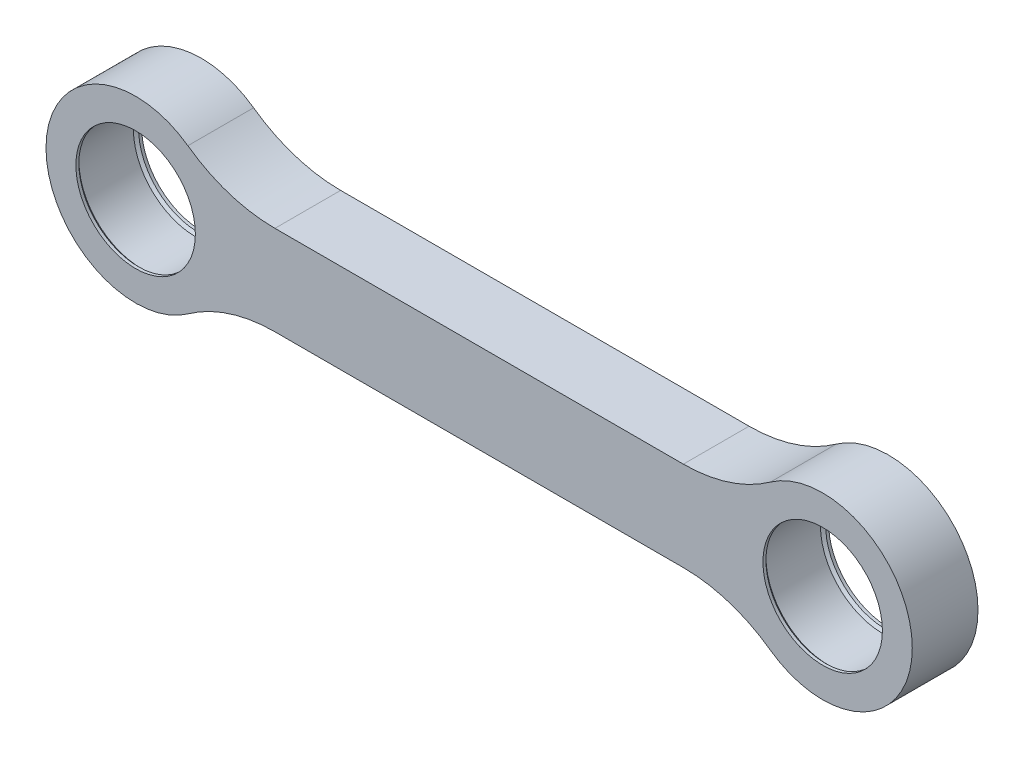
ISO-10303-21;
HEADER;
FILE_DESCRIPTION(('STEP AP214'),'2;1');
FILE_NAME('part.step','',(''),(''),'','','');
FILE_SCHEMA(('AUTOMOTIVE_DESIGN { 1 0 10303 214 1 1 1 1 }'));
ENDSEC;
DATA;
#1=APPLICATION_CONTEXT('core data for automotive mechanical design processes');
#2=APPLICATION_PROTOCOL_DEFINITION('international standard','automotive_design',2000,#1);
#3=PRODUCT_CONTEXT('',#1,'mechanical');
#4=PRODUCT('Part','Part','',(#3));
#5=PRODUCT_RELATED_PRODUCT_CATEGORY('part','',(#4));
#6=PRODUCT_DEFINITION_FORMATION('','',#4);
#7=PRODUCT_DEFINITION_CONTEXT('part definition',#1,'design');
#8=PRODUCT_DEFINITION('design','',#6,#7);
#9=PRODUCT_DEFINITION_SHAPE('','',#8);
#10=(LENGTH_UNIT() NAMED_UNIT(*) SI_UNIT(.MILLI.,.METRE.));
#11=(NAMED_UNIT(*) PLANE_ANGLE_UNIT() SI_UNIT($,.RADIAN.));
#12=(NAMED_UNIT(*) SI_UNIT($,.STERADIAN.) SOLID_ANGLE_UNIT());
#13=UNCERTAINTY_MEASURE_WITH_UNIT(LENGTH_MEASURE(1.E-05),#10,'distance_accuracy_value','');
#14=(GEOMETRIC_REPRESENTATION_CONTEXT(3) GLOBAL_UNCERTAINTY_ASSIGNED_CONTEXT((#13)) GLOBAL_UNIT_ASSIGNED_CONTEXT((#10,
#11,#12)) REPRESENTATION_CONTEXT('',''));
#15=CARTESIAN_POINT('',(0.,0.,0.));
#16=DIRECTION('',(0.,0.,1.));
#17=DIRECTION('',(1.,0.,0.));
#18=AXIS2_PLACEMENT_3D('',#15,#16,#17);
#19=CARTESIAN_POINT('',(46.,0.,4.));
#20=DIRECTION('',(0.,0.,-1.));
#21=DIRECTION('',(-1.,0.,0.));
#22=AXIS2_PLACEMENT_3D('',#19,#20,#21);
#23=CYLINDRICAL_SURFACE('',#22,4.00000000000001);
#24=CARTESIAN_POINT('',(46.,0.,-0.200000000000003));
#25=DIRECTION('',(0.,0.,1.));
#26=DIRECTION('',(1.,0.,0.));
#27=AXIS2_PLACEMENT_3D('',#24,#25,#26);
#28=CIRCLE('',#27,4.00000000000001);
#29=CARTESIAN_POINT('',(50.,0.,-0.200000000000003));
#30=VERTEX_POINT('',#29);
#31=EDGE_CURVE('E259',#30,#30,#28,.T.);
#32=ORIENTED_EDGE('',*,*,#31,.T.);
#33=EDGE_LOOP('',(#32));
#34=FACE_BOUND('',#33,.T.);
#35=CARTESIAN_POINT('',(46.,0.,-0.4));
#36=DIRECTION('',(0.,0.,1.));
#37=DIRECTION('',(1.,0.,0.));
#38=AXIS2_PLACEMENT_3D('',#35,#36,#37);
#39=CIRCLE('',#38,4.00000000000001);
#40=CARTESIAN_POINT('',(50.,0.,-0.4));
#41=VERTEX_POINT('',#40);
#42=EDGE_CURVE('E226',#41,#41,#39,.T.);
#43=ORIENTED_EDGE('',*,*,#42,.F.);
#44=EDGE_LOOP('',(#43));
#45=FACE_BOUND('',#44,.T.);
#46=ADVANCED_FACE('F135',(#34,#45),#23,.F.);
#47=CARTESIAN_POINT('',(0.,0.,-0.4));
#48=DIRECTION('',(0.,0.,1.));
#49=DIRECTION('',(1.,0.,0.));
#50=AXIS2_PLACEMENT_3D('',#47,#48,#49);
#51=CYLINDRICAL_SURFACE('',#50,4.);
#52=CARTESIAN_POINT('',(0.,0.,-0.200000000000004));
#53=DIRECTION('',(0.,0.,1.));
#54=DIRECTION('',(1.,0.,0.));
#55=AXIS2_PLACEMENT_3D('',#52,#53,#54);
#56=CIRCLE('',#55,4.);
#57=CARTESIAN_POINT('',(4.,0.,-0.200000000000004));
#58=VERTEX_POINT('',#57);
#59=EDGE_CURVE('E262',#58,#58,#56,.T.);
#60=ORIENTED_EDGE('',*,*,#59,.T.);
#61=EDGE_LOOP('',(#60));
#62=FACE_BOUND('',#61,.T.);
#63=CARTESIAN_POINT('',(0.,0.,-0.4));
#64=DIRECTION('',(0.,0.,1.));
#65=DIRECTION('',(1.,0.,0.));
#66=AXIS2_PLACEMENT_3D('',#63,#64,#65);
#67=CIRCLE('',#66,4.);
#68=CARTESIAN_POINT('',(4.,0.,-0.4));
#69=VERTEX_POINT('',#68);
#70=EDGE_CURVE('E248',#69,#69,#67,.T.);
#71=ORIENTED_EDGE('',*,*,#70,.F.);
#72=EDGE_LOOP('',(#71));
#73=FACE_BOUND('',#72,.T.);
#74=ADVANCED_FACE('F330',(#62,#73),#51,.F.);
#75=CARTESIAN_POINT('',(0.,0.,4.));
#76=DIRECTION('',(0.,0.,1.));
#77=DIRECTION('',(1.,0.,0.));
#78=AXIS2_PLACEMENT_3D('',#75,#76,#77);
#79=PLANE('',#78);
#80=DIRECTION('',(1.,0.,0.));
#81=VECTOR('',#80,1.);
#82=CARTESIAN_POINT('',(5.,3.,4.));
#83=LINE('',#82,#81);
#84=CARTESIAN_POINT('',(9.32737905308881,3.,4.));
#85=VERTEX_POINT('',#84);
#86=CARTESIAN_POINT('',(36.6726209469112,3.,4.));
#87=VERTEX_POINT('',#86);
#88=EDGE_CURVE('E229',#85,#87,#83,.T.);
#89=ORIENTED_EDGE('',*,*,#88,.F.);
#90=CARTESIAN_POINT('',(9.32737905308881,13.,4.));
#91=DIRECTION('',(0.,0.,1.));
#92=DIRECTION('',(1.,0.,0.));
#93=AXIS2_PLACEMENT_3D('',#90,#91,#92);
#94=CIRCLE('',#93,10.);
#95=CARTESIAN_POINT('',(3.4977671449083,4.875,4.));
#96=VERTEX_POINT('',#95);
#97=EDGE_CURVE('E294',#85,#96,#94,.F.);
#98=ORIENTED_EDGE('',*,*,#97,.T.);
#99=CARTESIAN_POINT('',(0.,0.,4.));
#100=DIRECTION('',(0.,0.,1.));
#101=DIRECTION('',(1.,0.,0.));
#102=AXIS2_PLACEMENT_3D('',#99,#100,#101);
#103=CIRCLE('',#102,6.);
#104=CARTESIAN_POINT('',(3.4977671449083,-4.875,4.));
#105=VERTEX_POINT('',#104);
#106=EDGE_CURVE('E245',#96,#105,#103,.T.);
#107=ORIENTED_EDGE('',*,*,#106,.T.);
#108=CARTESIAN_POINT('',(9.32737905308881,-13.,4.));
#109=DIRECTION('',(0.,0.,1.));
#110=DIRECTION('',(1.,0.,0.));
#111=AXIS2_PLACEMENT_3D('',#108,#109,#110);
#112=CIRCLE('',#111,10.);
#113=CARTESIAN_POINT('',(9.32737905308881,-3.,4.));
#114=VERTEX_POINT('',#113);
#115=EDGE_CURVE('E143',#105,#114,#112,.F.);
#116=ORIENTED_EDGE('',*,*,#115,.T.);
#117=DIRECTION('',(1.,0.,0.));
#118=VECTOR('',#117,1.);
#119=CARTESIAN_POINT('',(5.,-3.,4.));
#120=LINE('',#119,#118);
#121=CARTESIAN_POINT('',(36.6726209469112,-3.,4.));
#122=VERTEX_POINT('',#121);
#123=EDGE_CURVE('E225',#114,#122,#120,.T.);
#124=ORIENTED_EDGE('',*,*,#123,.T.);
#125=CARTESIAN_POINT('',(36.6726209469112,-13.,4.));
#126=DIRECTION('',(0.,0.,1.));
#127=DIRECTION('',(1.,0.,0.));
#128=AXIS2_PLACEMENT_3D('',#125,#126,#127);
#129=CIRCLE('',#128,10.);
#130=CARTESIAN_POINT('',(42.5022328550917,-4.875,4.));
#131=VERTEX_POINT('',#130);
#132=EDGE_CURVE('E208',#122,#131,#129,.F.);
#133=ORIENTED_EDGE('',*,*,#132,.T.);
#134=CARTESIAN_POINT('',(46.,0.,4.));
#135=DIRECTION('',(0.,0.,1.));
#136=DIRECTION('',(1.,0.,0.));
#137=AXIS2_PLACEMENT_3D('',#134,#135,#136);
#138=CIRCLE('',#137,6.00000000000001);
#139=CARTESIAN_POINT('',(42.5022328550917,4.87500000000001,4.));
#140=VERTEX_POINT('',#139);
#141=EDGE_CURVE('E217',#131,#140,#138,.T.);
#142=ORIENTED_EDGE('',*,*,#141,.T.);
#143=CARTESIAN_POINT('',(36.6726209469112,13.,4.));
#144=DIRECTION('',(0.,0.,1.));
#145=DIRECTION('',(1.,0.,0.));
#146=AXIS2_PLACEMENT_3D('',#143,#144,#145);
#147=CIRCLE('',#146,10.);
#148=EDGE_CURVE('E292',#140,#87,#147,.F.);
#149=ORIENTED_EDGE('',*,*,#148,.T.);
#150=EDGE_LOOP('',(#89,#98,#107,#116,#124,#133,#142,#149));
#151=FACE_BOUND('',#150,.T.);
#152=CARTESIAN_POINT('',(0.,0.,4.));
#153=DIRECTION('',(0.,0.,1.));
#154=DIRECTION('',(1.,0.,0.));
#155=AXIS2_PLACEMENT_3D('',#152,#153,#154);
#156=CIRCLE('',#155,4.);
#157=CARTESIAN_POINT('',(4.,0.,4.));
#158=VERTEX_POINT('',#157);
#159=EDGE_CURVE('E242',#158,#158,#156,.T.);
#160=ORIENTED_EDGE('',*,*,#159,.F.);
#161=EDGE_LOOP('',(#160));
#162=FACE_BOUND('',#161,.T.);
#163=CARTESIAN_POINT('',(46.,0.,4.));
#164=DIRECTION('',(0.,0.,1.));
#165=DIRECTION('',(1.,0.,0.));
#166=AXIS2_PLACEMENT_3D('',#163,#164,#165);
#167=CIRCLE('',#166,4.00000000000001);
#168=CARTESIAN_POINT('',(50.,0.,4.));
#169=VERTEX_POINT('',#168);
#170=EDGE_CURVE('E238',#169,#169,#167,.T.);
#171=ORIENTED_EDGE('',*,*,#170,.F.);
#172=EDGE_LOOP('',(#171));
#173=FACE_BOUND('',#172,.T.);
#174=ADVANCED_FACE('F300',(#151,#162,#173),#79,.T.);
#175=CARTESIAN_POINT('',(5.,-3.,4.));
#176=DIRECTION('',(0.,1.,0.));
#177=DIRECTION('',(0.,0.,1.));
#178=AXIS2_PLACEMENT_3D('',#175,#176,#177);
#179=PLANE('',#178);
#180=DIRECTION('',(1.,0.,0.));
#181=VECTOR('',#180,1.);
#182=CARTESIAN_POINT('',(5.,-3.,-0.4));
#183=LINE('',#182,#181);
#184=CARTESIAN_POINT('',(9.32737905308881,-3.,-0.4));
#185=VERTEX_POINT('',#184);
#186=CARTESIAN_POINT('',(36.6726209469112,-3.,-0.4));
#187=VERTEX_POINT('',#186);
#188=EDGE_CURVE('E319',#185,#187,#183,.T.);
#189=ORIENTED_EDGE('',*,*,#188,.T.);
#190=DIRECTION('',(0.,0.,1.));
#191=VECTOR('',#190,1.);
#192=CARTESIAN_POINT('',(36.6726209469112,-3.,4.));
#193=LINE('',#192,#191);
#194=EDGE_CURVE('E205',#187,#122,#193,.T.);
#195=ORIENTED_EDGE('',*,*,#194,.T.);
#196=ORIENTED_EDGE('',*,*,#123,.F.);
#197=DIRECTION('',(0.,0.,1.));
#198=VECTOR('',#197,1.);
#199=CARTESIAN_POINT('',(9.32737905308881,-3.,4.));
#200=LINE('',#199,#198);
#201=EDGE_CURVE('E218',#114,#185,#200,.F.);
#202=ORIENTED_EDGE('',*,*,#201,.T.);
#203=EDGE_LOOP('',(#189,#195,#196,#202));
#204=FACE_BOUND('',#203,.T.);
#205=ADVANCED_FACE('F306',(#204),#179,.F.);
#206=CARTESIAN_POINT('',(5.,3.,4.));
#207=DIRECTION('',(0.,1.,0.));
#208=DIRECTION('',(0.,0.,1.));
#209=AXIS2_PLACEMENT_3D('',#206,#207,#208);
#210=PLANE('',#209);
#211=ORIENTED_EDGE('',*,*,#88,.T.);
#212=DIRECTION('',(0.,0.,-1.));
#213=VECTOR('',#212,1.);
#214=CARTESIAN_POINT('',(36.6726209469112,3.,4.));
#215=LINE('',#214,#213);
#216=CARTESIAN_POINT('',(36.6726209469112,3.,-0.4));
#217=VERTEX_POINT('',#216);
#218=EDGE_CURVE('E283',#87,#217,#215,.T.);
#219=ORIENTED_EDGE('',*,*,#218,.T.);
#220=DIRECTION('',(1.,0.,0.));
#221=VECTOR('',#220,1.);
#222=CARTESIAN_POINT('',(5.,3.,-0.4));
#223=LINE('',#222,#221);
#224=CARTESIAN_POINT('',(9.32737905308881,3.,-0.4));
#225=VERTEX_POINT('',#224);
#226=EDGE_CURVE('E232',#225,#217,#223,.T.);
#227=ORIENTED_EDGE('',*,*,#226,.F.);
#228=DIRECTION('',(0.,0.,-1.));
#229=VECTOR('',#228,1.);
#230=CARTESIAN_POINT('',(9.32737905308881,3.,4.));
#231=LINE('',#230,#229);
#232=EDGE_CURVE('E280',#225,#85,#231,.F.);
#233=ORIENTED_EDGE('',*,*,#232,.T.);
#234=EDGE_LOOP('',(#211,#219,#227,#233));
#235=FACE_BOUND('',#234,.T.);
#236=ADVANCED_FACE('F314',(#235),#210,.T.);
#237=CARTESIAN_POINT('',(46.,0.,4.));
#238=DIRECTION('',(0.,0.,-1.));
#239=DIRECTION('',(-1.,0.,0.));
#240=AXIS2_PLACEMENT_3D('',#237,#238,#239);
#241=CYLINDRICAL_SURFACE('',#240,6.00000000000001);
#242=ORIENTED_EDGE('',*,*,#141,.F.);
#243=DIRECTION('',(0.,0.,-1.));
#244=VECTOR('',#243,1.);
#245=CARTESIAN_POINT('',(42.5022328550917,-4.875,4.));
#246=LINE('',#245,#244);
#247=CARTESIAN_POINT('',(42.5022328550917,-4.875,-0.4));
#248=VERTEX_POINT('',#247);
#249=EDGE_CURVE('E204',#131,#248,#246,.T.);
#250=ORIENTED_EDGE('',*,*,#249,.T.);
#251=CARTESIAN_POINT('',(46.,0.,-0.4));
#252=DIRECTION('',(0.,0.,1.));
#253=DIRECTION('',(1.,0.,0.));
#254=AXIS2_PLACEMENT_3D('',#251,#252,#253);
#255=CIRCLE('',#254,6.00000000000001);
#256=CARTESIAN_POINT('',(42.5022328550917,4.87500000000001,-0.4));
#257=VERTEX_POINT('',#256);
#258=EDGE_CURVE('E214',#248,#257,#255,.T.);
#259=ORIENTED_EDGE('',*,*,#258,.T.);
#260=DIRECTION('',(0.,0.,-1.));
#261=VECTOR('',#260,1.);
#262=CARTESIAN_POINT('',(42.5022328550917,4.87500000000001,4.));
#263=LINE('',#262,#261);
#264=EDGE_CURVE('E219',#257,#140,#263,.F.);
#265=ORIENTED_EDGE('',*,*,#264,.T.);
#266=EDGE_LOOP('',(#242,#250,#259,#265));
#267=FACE_BOUND('',#266,.T.);
#268=ADVANCED_FACE('F213',(#267),#241,.T.);
#269=CARTESIAN_POINT('',(46.,0.,3.8));
#270=DIRECTION('',(0.,0.,1.));
#271=DIRECTION('',(1.,0.,0.));
#272=AXIS2_PLACEMENT_3D('',#269,#270,#271);
#273=CIRCLE('',#272,4.00000000000001);
#274=CARTESIAN_POINT('',(50.,0.,3.8));
#275=VERTEX_POINT('',#274);
#276=EDGE_CURVE('E256',#275,#275,#273,.F.);
#277=ORIENTED_EDGE('',*,*,#276,.T.);
#278=EDGE_LOOP('',(#277));
#279=FACE_BOUND('',#278,.T.);
#280=ORIENTED_EDGE('',*,*,#170,.T.);
#281=EDGE_LOOP('',(#280));
#282=FACE_BOUND('',#281,.T.);
#283=ADVANCED_FACE('F333',(#279,#282),#23,.F.);
#284=CARTESIAN_POINT('',(0.,0.,3.8));
#285=DIRECTION('',(0.,0.,1.));
#286=DIRECTION('',(1.,0.,0.));
#287=AXIS2_PLACEMENT_3D('',#284,#285,#286);
#288=CIRCLE('',#287,4.);
#289=CARTESIAN_POINT('',(4.,0.,3.8));
#290=VERTEX_POINT('',#289);
#291=EDGE_CURVE('E253',#290,#290,#288,.F.);
#292=ORIENTED_EDGE('',*,*,#291,.T.);
#293=EDGE_LOOP('',(#292));
#294=FACE_BOUND('',#293,.T.);
#295=ORIENTED_EDGE('',*,*,#159,.T.);
#296=EDGE_LOOP('',(#295));
#297=FACE_BOUND('',#296,.T.);
#298=ADVANCED_FACE('F339',(#294,#297),#51,.F.);
#299=CARTESIAN_POINT('',(0.,0.,-0.4));
#300=DIRECTION('',(0.,0.,1.));
#301=DIRECTION('',(1.,0.,0.));
#302=AXIS2_PLACEMENT_3D('',#299,#300,#301);
#303=CYLINDRICAL_SURFACE('',#302,6.);
#304=ORIENTED_EDGE('',*,*,#106,.F.);
#305=DIRECTION('',(0.,0.,1.));
#306=VECTOR('',#305,1.);
#307=CARTESIAN_POINT('',(3.4977671449083,4.875,-0.4));
#308=LINE('',#307,#306);
#309=CARTESIAN_POINT('',(3.4977671449083,4.875,-0.4));
#310=VERTEX_POINT('',#309);
#311=EDGE_CURVE('E155',#96,#310,#308,.F.);
#312=ORIENTED_EDGE('',*,*,#311,.T.);
#313=CARTESIAN_POINT('',(0.,0.,-0.4));
#314=DIRECTION('',(0.,0.,1.));
#315=DIRECTION('',(1.,0.,0.));
#316=AXIS2_PLACEMENT_3D('',#313,#314,#315);
#317=CIRCLE('',#316,6.);
#318=CARTESIAN_POINT('',(3.4977671449083,-4.875,-0.4));
#319=VERTEX_POINT('',#318);
#320=EDGE_CURVE('E251',#310,#319,#317,.T.);
#321=ORIENTED_EDGE('',*,*,#320,.T.);
#322=DIRECTION('',(0.,0.,1.));
#323=VECTOR('',#322,1.);
#324=CARTESIAN_POINT('',(3.4977671449083,-4.875,-0.4));
#325=LINE('',#324,#323);
#326=EDGE_CURVE('E286',#319,#105,#325,.T.);
#327=ORIENTED_EDGE('',*,*,#326,.T.);
#328=EDGE_LOOP('',(#304,#312,#321,#327));
#329=FACE_BOUND('',#328,.T.);
#330=ADVANCED_FACE('F307',(#329),#303,.T.);
#331=CARTESIAN_POINT('',(0.,0.,-0.4));
#332=DIRECTION('',(0.,0.,1.));
#333=DIRECTION('',(1.,0.,0.));
#334=AXIS2_PLACEMENT_3D('',#331,#332,#333);
#335=PLANE('',#334);
#336=ORIENTED_EDGE('',*,*,#188,.F.);
#337=CARTESIAN_POINT('',(9.32737905308881,-13.,-0.4));
#338=DIRECTION('',(0.,0.,1.));
#339=DIRECTION('',(1.,0.,0.));
#340=AXIS2_PLACEMENT_3D('',#337,#338,#339);
#341=CIRCLE('',#340,10.);
#342=EDGE_CURVE('E12',#185,#319,#341,.T.);
#343=ORIENTED_EDGE('',*,*,#342,.T.);
#344=ORIENTED_EDGE('',*,*,#320,.F.);
#345=CARTESIAN_POINT('',(9.32737905308881,13.,-0.4));
#346=DIRECTION('',(0.,0.,1.));
#347=DIRECTION('',(1.,0.,0.));
#348=AXIS2_PLACEMENT_3D('',#345,#346,#347);
#349=CIRCLE('',#348,10.);
#350=EDGE_CURVE('E296',#310,#225,#349,.T.);
#351=ORIENTED_EDGE('',*,*,#350,.T.);
#352=ORIENTED_EDGE('',*,*,#226,.T.);
#353=CARTESIAN_POINT('',(36.6726209469112,13.,-0.4));
#354=DIRECTION('',(0.,0.,1.));
#355=DIRECTION('',(1.,0.,0.));
#356=AXIS2_PLACEMENT_3D('',#353,#354,#355);
#357=CIRCLE('',#356,10.);
#358=EDGE_CURVE('E224',#217,#257,#357,.T.);
#359=ORIENTED_EDGE('',*,*,#358,.T.);
#360=ORIENTED_EDGE('',*,*,#258,.F.);
#361=CARTESIAN_POINT('',(36.6726209469112,-13.,-0.4));
#362=DIRECTION('',(0.,0.,1.));
#363=DIRECTION('',(1.,0.,0.));
#364=AXIS2_PLACEMENT_3D('',#361,#362,#363);
#365=CIRCLE('',#364,10.);
#366=EDGE_CURVE('E200',#248,#187,#365,.T.);
#367=ORIENTED_EDGE('',*,*,#366,.T.);
#368=EDGE_LOOP('',(#336,#343,#344,#351,#352,#359,#360,#367));
#369=FACE_BOUND('',#368,.T.);
#370=ORIENTED_EDGE('',*,*,#70,.T.);
#371=EDGE_LOOP('',(#370));
#372=FACE_BOUND('',#371,.T.);
#373=ORIENTED_EDGE('',*,*,#42,.T.);
#374=EDGE_LOOP('',(#373));
#375=FACE_BOUND('',#374,.T.);
#376=ADVANCED_FACE('F221',(#369,#372,#375),#335,.F.);
#377=CARTESIAN_POINT('',(0.,0.,3.6));
#378=DIRECTION('',(0.,0.,-1.));
#379=DIRECTION('',(-1.,0.,0.));
#380=AXIS2_PLACEMENT_3D('',#377,#378,#379);
#381=CYLINDRICAL_SURFACE('',#380,4.175);
#382=CARTESIAN_POINT('',(0.,0.,-0.0250000000000019));
#383=DIRECTION('',(0.,0.,1.));
#384=DIRECTION('',(1.,0.,0.));
#385=AXIS2_PLACEMENT_3D('',#382,#383,#384);
#386=CIRCLE('',#385,4.175);
#387=CARTESIAN_POINT('',(4.175,0.,-0.0250000000000019));
#388=VERTEX_POINT('',#387);
#389=EDGE_CURVE('E274',#388,#388,#386,.F.);
#390=ORIENTED_EDGE('',*,*,#389,.T.);
#391=EDGE_LOOP('',(#390));
#392=FACE_BOUND('',#391,.T.);
#393=CARTESIAN_POINT('',(0.,0.,3.625));
#394=DIRECTION('',(0.,0.,-1.));
#395=DIRECTION('',(-1.,0.,0.));
#396=AXIS2_PLACEMENT_3D('',#393,#394,#395);
#397=CIRCLE('',#396,4.175);
#398=CARTESIAN_POINT('',(-4.175,0.,3.625));
#399=VERTEX_POINT('',#398);
#400=EDGE_CURVE('E265',#399,#399,#397,.F.);
#401=ORIENTED_EDGE('',*,*,#400,.T.);
#402=EDGE_LOOP('',(#401));
#403=FACE_BOUND('',#402,.T.);
#404=ADVANCED_FACE('F362',(#392,#403),#381,.F.);
#405=CARTESIAN_POINT('',(46.,0.,3.6));
#406=DIRECTION('',(0.,0.,-1.));
#407=DIRECTION('',(-1.,0.,0.));
#408=AXIS2_PLACEMENT_3D('',#405,#406,#407);
#409=CYLINDRICAL_SURFACE('',#408,4.175);
#410=CARTESIAN_POINT('',(46.,0.,-0.0250000000000129));
#411=DIRECTION('',(0.,0.,1.));
#412=DIRECTION('',(1.,0.,0.));
#413=AXIS2_PLACEMENT_3D('',#410,#411,#412);
#414=CIRCLE('',#413,4.175);
#415=CARTESIAN_POINT('',(50.175,0.,-0.0250000000000129));
#416=VERTEX_POINT('',#415);
#417=EDGE_CURVE('E271',#416,#416,#414,.F.);
#418=ORIENTED_EDGE('',*,*,#417,.T.);
#419=EDGE_LOOP('',(#418));
#420=FACE_BOUND('',#419,.T.);
#421=CARTESIAN_POINT('',(46.,0.,3.62500000000001));
#422=DIRECTION('',(0.,0.,-1.));
#423=DIRECTION('',(-1.,0.,0.));
#424=AXIS2_PLACEMENT_3D('',#421,#422,#423);
#425=CIRCLE('',#424,4.175);
#426=CARTESIAN_POINT('',(41.825,0.,3.62500000000001));
#427=VERTEX_POINT('',#426);
#428=EDGE_CURVE('E268',#427,#427,#425,.F.);
#429=ORIENTED_EDGE('',*,*,#428,.T.);
#430=EDGE_LOOP('',(#429));
#431=FACE_BOUND('',#430,.T.);
#432=ADVANCED_FACE('F373',(#420,#431),#409,.F.);
#433=CARTESIAN_POINT('',(0.,0.,3.6));
#434=DIRECTION('',(0.,0.,-1.));
#435=DIRECTION('',(-1.,0.,0.));
#436=AXIS2_PLACEMENT_3D('',#433,#434,#435);
#437=CONICAL_SURFACE('',#436,4.2,0.785398163397453);
#438=ORIENTED_EDGE('',*,*,#291,.F.);
#439=EDGE_LOOP('',(#438));
#440=FACE_BOUND('',#439,.T.);
#441=ORIENTED_EDGE('',*,*,#400,.F.);
#442=EDGE_LOOP('',(#441));
#443=FACE_BOUND('',#442,.T.);
#444=ADVANCED_FACE('F366',(#440,#443),#437,.F.);
#445=CARTESIAN_POINT('',(46.,0.,3.6));
#446=DIRECTION('',(0.,0.,-1.));
#447=DIRECTION('',(-1.,0.,0.));
#448=AXIS2_PLACEMENT_3D('',#445,#446,#447);
#449=CONICAL_SURFACE('',#448,4.20000000000001,0.785398163397453);
#450=ORIENTED_EDGE('',*,*,#276,.F.);
#451=EDGE_LOOP('',(#450));
#452=FACE_BOUND('',#451,.T.);
#453=ORIENTED_EDGE('',*,*,#428,.F.);
#454=EDGE_LOOP('',(#453));
#455=FACE_BOUND('',#454,.T.);
#456=ADVANCED_FACE('F372',(#452,#455),#449,.F.);
#457=CARTESIAN_POINT('',(46.,0.,-0.200000000000003));
#458=DIRECTION('',(0.,0.,1.));
#459=DIRECTION('',(1.,0.,0.));
#460=AXIS2_PLACEMENT_3D('',#457,#458,#459);
#461=CONICAL_SURFACE('',#460,4.00000000000001,0.785398163397448);
#462=ORIENTED_EDGE('',*,*,#417,.F.);
#463=EDGE_LOOP('',(#462));
#464=FACE_BOUND('',#463,.T.);
#465=ORIENTED_EDGE('',*,*,#31,.F.);
#466=EDGE_LOOP('',(#465));
#467=FACE_BOUND('',#466,.T.);
#468=ADVANCED_FACE('F380',(#464,#467),#461,.F.);
#469=CARTESIAN_POINT('',(0.,0.,-0.200000000000004));
#470=DIRECTION('',(0.,0.,1.));
#471=DIRECTION('',(1.,0.,0.));
#472=AXIS2_PLACEMENT_3D('',#469,#470,#471);
#473=CONICAL_SURFACE('',#472,4.,0.785398163397443);
#474=ORIENTED_EDGE('',*,*,#389,.F.);
#475=EDGE_LOOP('',(#474));
#476=FACE_BOUND('',#475,.T.);
#477=ORIENTED_EDGE('',*,*,#59,.F.);
#478=EDGE_LOOP('',(#477));
#479=FACE_BOUND('',#478,.T.);
#480=ADVANCED_FACE('F327',(#476,#479),#473,.F.);
#481=CARTESIAN_POINT('',(36.6726209469112,-13.,4.));
#482=DIRECTION('',(0.,0.,-1.));
#483=DIRECTION('',(-1.,0.,0.));
#484=AXIS2_PLACEMENT_3D('',#481,#482,#483);
#485=CYLINDRICAL_SURFACE('',#484,10.);
#486=ORIENTED_EDGE('',*,*,#132,.F.);
#487=ORIENTED_EDGE('',*,*,#194,.F.);
#488=ORIENTED_EDGE('',*,*,#366,.F.);
#489=ORIENTED_EDGE('',*,*,#249,.F.);
#490=EDGE_LOOP('',(#486,#487,#488,#489));
#491=FACE_BOUND('',#490,.T.);
#492=ADVANCED_FACE('F203',(#491),#485,.F.);
#493=CARTESIAN_POINT('',(36.6726209469112,13.,4.));
#494=DIRECTION('',(0.,0.,-1.));
#495=DIRECTION('',(-1.,0.,0.));
#496=AXIS2_PLACEMENT_3D('',#493,#494,#495);
#497=CYLINDRICAL_SURFACE('',#496,10.);
#498=ORIENTED_EDGE('',*,*,#148,.F.);
#499=ORIENTED_EDGE('',*,*,#264,.F.);
#500=ORIENTED_EDGE('',*,*,#358,.F.);
#501=ORIENTED_EDGE('',*,*,#218,.F.);
#502=EDGE_LOOP('',(#498,#499,#500,#501));
#503=FACE_BOUND('',#502,.T.);
#504=ADVANCED_FACE('F318',(#503),#497,.F.);
#505=CARTESIAN_POINT('',(9.32737905308881,13.,-0.4));
#506=DIRECTION('',(0.,0.,1.));
#507=DIRECTION('',(1.,0.,0.));
#508=AXIS2_PLACEMENT_3D('',#505,#506,#507);
#509=CYLINDRICAL_SURFACE('',#508,10.);
#510=ORIENTED_EDGE('',*,*,#350,.F.);
#511=ORIENTED_EDGE('',*,*,#311,.F.);
#512=ORIENTED_EDGE('',*,*,#97,.F.);
#513=ORIENTED_EDGE('',*,*,#232,.F.);
#514=EDGE_LOOP('',(#510,#511,#512,#513));
#515=FACE_BOUND('',#514,.T.);
#516=ADVANCED_FACE('F312',(#515),#509,.F.);
#517=CARTESIAN_POINT('',(9.32737905308881,-13.,-0.4));
#518=DIRECTION('',(0.,0.,1.));
#519=DIRECTION('',(1.,0.,0.));
#520=AXIS2_PLACEMENT_3D('',#517,#518,#519);
#521=CYLINDRICAL_SURFACE('',#520,10.);
#522=ORIENTED_EDGE('',*,*,#342,.F.);
#523=ORIENTED_EDGE('',*,*,#201,.F.);
#524=ORIENTED_EDGE('',*,*,#115,.F.);
#525=ORIENTED_EDGE('',*,*,#326,.F.);
#526=EDGE_LOOP('',(#522,#523,#524,#525));
#527=FACE_BOUND('',#526,.T.);
#528=ADVANCED_FACE('F137',(#527),#521,.F.);
#529=CLOSED_SHELL('',(#46,#74,#174,#205,#236,#268,#283,#298,#330,#376,#404,#432,#444,#456,#468,
#480,#492,#504,#516,#528));
#530=MANIFOLD_SOLID_BREP('B2',#529);
#531=ADVANCED_BREP_SHAPE_REPRESENTATION('',(#18,#530),#14);
#532=SHAPE_DEFINITION_REPRESENTATION(#9,#531);
ENDSEC;
END-ISO-10303-21;
